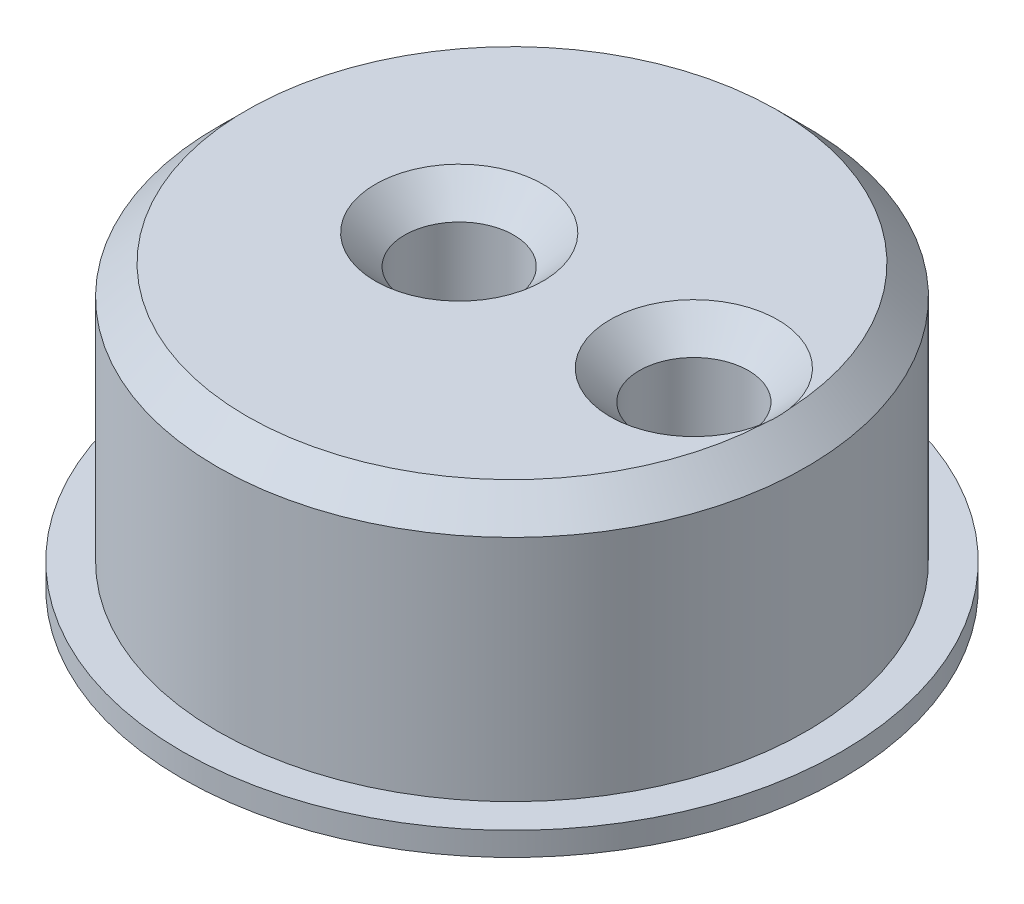
ISO-10303-21;
HEADER;
FILE_DESCRIPTION(('STEP AP214'),'2;1');
FILE_NAME('part.step','',(''),(''),'','','');
FILE_SCHEMA(('AUTOMOTIVE_DESIGN { 1 0 10303 214 1 1 1 1 }'));
ENDSEC;
DATA;
#1=APPLICATION_CONTEXT('core data for automotive mechanical design processes');
#2=APPLICATION_PROTOCOL_DEFINITION('international standard','automotive_design',2000,#1);
#3=PRODUCT_CONTEXT('',#1,'mechanical');
#4=PRODUCT('Part','Part','',(#3));
#5=PRODUCT_RELATED_PRODUCT_CATEGORY('part','',(#4));
#6=PRODUCT_DEFINITION_FORMATION('','',#4);
#7=PRODUCT_DEFINITION_CONTEXT('part definition',#1,'design');
#8=PRODUCT_DEFINITION('design','',#6,#7);
#9=PRODUCT_DEFINITION_SHAPE('','',#8);
#10=(LENGTH_UNIT() NAMED_UNIT(*) SI_UNIT(.MILLI.,.METRE.));
#11=(NAMED_UNIT(*) PLANE_ANGLE_UNIT() SI_UNIT($,.RADIAN.));
#12=(NAMED_UNIT(*) SI_UNIT($,.STERADIAN.) SOLID_ANGLE_UNIT());
#13=UNCERTAINTY_MEASURE_WITH_UNIT(LENGTH_MEASURE(1.E-05),#10,'distance_accuracy_value','');
#14=(GEOMETRIC_REPRESENTATION_CONTEXT(3) GLOBAL_UNCERTAINTY_ASSIGNED_CONTEXT((#13)) GLOBAL_UNIT_ASSIGNED_CONTEXT((#10,
#11,#12)) REPRESENTATION_CONTEXT('',''));
#15=CARTESIAN_POINT('',(0.,0.,0.));
#16=DIRECTION('',(0.,0.,1.));
#17=DIRECTION('',(1.,0.,0.));
#18=AXIS2_PLACEMENT_3D('',#15,#16,#17);
#19=CARTESIAN_POINT('',(0.,4.4,0.));
#20=DIRECTION('',(0.,1.,0.));
#21=DIRECTION('',(0.,0.,1.));
#22=AXIS2_PLACEMENT_3D('',#19,#20,#21);
#23=PLANE('',#22);
#24=CARTESIAN_POINT('',(-0.9,4.4,0.));
#25=DIRECTION('',(0.,1.,0.));
#26=DIRECTION('',(0.,0.,1.));
#27=AXIS2_PLACEMENT_3D('',#24,#25,#26);
#28=CIRCLE('',#27,1.43000000000001);
#29=CARTESIAN_POINT('',(-0.9,4.4,1.43000000000001));
#30=VERTEX_POINT('',#29);
#31=EDGE_CURVE('E57',#30,#30,#28,.F.);
#32=ORIENTED_EDGE('',*,*,#31,.T.);
#33=EDGE_LOOP('',(#32));
#34=FACE_BOUND('',#33,.T.);
#35=CARTESIAN_POINT('',(3.1,4.4,0.));
#36=DIRECTION('',(0.,1.,0.));
#37=DIRECTION('',(0.,0.,1.));
#38=AXIS2_PLACEMENT_3D('',#35,#36,#37);
#39=CIRCLE('',#38,1.43);
#40=CARTESIAN_POINT('',(3.1,4.4,1.43));
#41=VERTEX_POINT('',#40);
#42=CARTESIAN_POINT('',(4.51540322580645,4.4,-0.203798205037956));
#43=VERTEX_POINT('',#42);
#44=EDGE_CURVE('E76',#41,#43,#39,.F.);
#45=ORIENTED_EDGE('',*,*,#44,.T.);
#46=CARTESIAN_POINT('',(0.,4.4,0.));
#47=DIRECTION('',(0.,1.,0.));
#48=DIRECTION('',(0.,0.,1.));
#49=AXIS2_PLACEMENT_3D('',#46,#47,#48);
#50=CIRCLE('',#49,4.52);
#51=CARTESIAN_POINT('',(0.,4.4,4.52));
#52=VERTEX_POINT('',#51);
#53=EDGE_CURVE('E95',#43,#52,#50,.T.);
#54=ORIENTED_EDGE('',*,*,#53,.T.);
#55=CARTESIAN_POINT('',(0.,4.4,0.));
#56=DIRECTION('',(0.,1.,0.));
#57=DIRECTION('',(0.,0.,1.));
#58=AXIS2_PLACEMENT_3D('',#55,#56,#57);
#59=CIRCLE('',#58,4.52);
#60=CARTESIAN_POINT('',(4.51540322580645,4.4,0.203798205037956));
#61=VERTEX_POINT('',#60);
#62=EDGE_CURVE('E64',#52,#61,#59,.T.);
#63=ORIENTED_EDGE('',*,*,#62,.T.);
#64=CARTESIAN_POINT('',(3.1,4.4,0.));
#65=DIRECTION('',(0.,1.,0.));
#66=DIRECTION('',(0.,0.,1.));
#67=AXIS2_PLACEMENT_3D('',#64,#65,#66);
#68=CIRCLE('',#67,1.43);
#69=EDGE_CURVE('E74',#61,#41,#68,.F.);
#70=ORIENTED_EDGE('',*,*,#69,.T.);
#71=EDGE_LOOP('',(#45,#54,#63,#70));
#72=FACE_BOUND('',#71,.T.);
#73=ADVANCED_FACE('F41',(#34,#72),#23,.T.);
#74=CARTESIAN_POINT('',(0.,4.4,0.));
#75=DIRECTION('',(0.,-1.,0.));
#76=DIRECTION('',(0.,0.,-1.));
#77=AXIS2_PLACEMENT_3D('',#74,#75,#76);
#78=CYLINDRICAL_SURFACE('',#77,5.02);
#79=CARTESIAN_POINT('',(0.,3.9,0.));
#80=DIRECTION('',(0.,1.,0.));
#81=DIRECTION('',(0.,0.,1.));
#82=AXIS2_PLACEMENT_3D('',#79,#80,#81);
#83=CIRCLE('',#82,5.02);
#84=CARTESIAN_POINT('',(0.,3.9,5.02));
#85=VERTEX_POINT('',#84);
#86=EDGE_CURVE('E11',#85,#85,#83,.F.);
#87=ORIENTED_EDGE('',*,*,#86,.T.);
#88=EDGE_LOOP('',(#87));
#89=FACE_BOUND('',#88,.T.);
#90=CARTESIAN_POINT('',(0.,0.,0.));
#91=DIRECTION('',(0.,1.,0.));
#92=DIRECTION('',(0.,0.,1.));
#93=AXIS2_PLACEMENT_3D('',#90,#91,#92);
#94=CIRCLE('',#93,5.02);
#95=CARTESIAN_POINT('',(0.,0.,5.02));
#96=VERTEX_POINT('',#95);
#97=EDGE_CURVE('E128',#96,#96,#94,.T.);
#98=ORIENTED_EDGE('',*,*,#97,.T.);
#99=EDGE_LOOP('',(#98));
#100=FACE_BOUND('',#99,.T.);
#101=ADVANCED_FACE('F162',(#89,#100),#78,.T.);
#102=CARTESIAN_POINT('',(3.1,4.4,0.));
#103=DIRECTION('',(0.,-1.,0.));
#104=DIRECTION('',(0.,0.,-1.));
#105=AXIS2_PLACEMENT_3D('',#102,#103,#104);
#106=CYLINDRICAL_SURFACE('',#105,0.930000000000001);
#107=CARTESIAN_POINT('',(3.1,0.100000000000004,0.));
#108=DIRECTION('',(0.,-1.,0.));
#109=DIRECTION('',(0.,0.,-1.));
#110=AXIS2_PLACEMENT_3D('',#107,#108,#109);
#111=CIRCLE('',#110,0.930000000000001);
#112=CARTESIAN_POINT('',(3.1,0.100000000000004,-0.930000000000001));
#113=VERTEX_POINT('',#112);
#114=EDGE_CURVE('E120',#113,#113,#111,.T.);
#115=ORIENTED_EDGE('',*,*,#114,.T.);
#116=EDGE_LOOP('',(#115));
#117=FACE_BOUND('',#116,.T.);
#118=CARTESIAN_POINT('',(3.1,3.9,0.));
#119=DIRECTION('',(0.,1.,0.));
#120=DIRECTION('',(0.,0.,1.));
#121=AXIS2_PLACEMENT_3D('',#118,#119,#120);
#122=CIRCLE('',#121,0.930000000000001);
#123=CARTESIAN_POINT('',(3.1,3.9,0.930000000000001));
#124=VERTEX_POINT('',#123);
#125=EDGE_CURVE('E124',#124,#124,#122,.T.);
#126=ORIENTED_EDGE('',*,*,#125,.T.);
#127=EDGE_LOOP('',(#126));
#128=FACE_BOUND('',#127,.T.);
#129=ADVANCED_FACE('F167',(#117,#128),#106,.F.);
#130=CARTESIAN_POINT('',(-0.9,4.4,0.));
#131=DIRECTION('',(0.,-1.,0.));
#132=DIRECTION('',(0.,0.,-1.));
#133=AXIS2_PLACEMENT_3D('',#130,#131,#132);
#134=CYLINDRICAL_SURFACE('',#133,0.93);
#135=CARTESIAN_POINT('',(-0.9,0.100000000000002,0.));
#136=DIRECTION('',(0.,-1.,0.));
#137=DIRECTION('',(0.,0.,-1.));
#138=AXIS2_PLACEMENT_3D('',#135,#136,#137);
#139=CIRCLE('',#138,0.93);
#140=CARTESIAN_POINT('',(-0.9,0.100000000000002,-0.93));
#141=VERTEX_POINT('',#140);
#142=EDGE_CURVE('E83',#141,#141,#139,.T.);
#143=ORIENTED_EDGE('',*,*,#142,.T.);
#144=EDGE_LOOP('',(#143));
#145=FACE_BOUND('',#144,.T.);
#146=CARTESIAN_POINT('',(-0.9,3.9,0.));
#147=DIRECTION('',(0.,1.,0.));
#148=DIRECTION('',(0.,0.,1.));
#149=AXIS2_PLACEMENT_3D('',#146,#147,#148);
#150=CIRCLE('',#149,0.93);
#151=CARTESIAN_POINT('',(-0.9,3.9,0.930000000000001));
#152=VERTEX_POINT('',#151);
#153=EDGE_CURVE('E89',#152,#152,#150,.T.);
#154=ORIENTED_EDGE('',*,*,#153,.T.);
#155=EDGE_LOOP('',(#154));
#156=FACE_BOUND('',#155,.T.);
#157=ADVANCED_FACE('F157',(#145,#156),#134,.F.);
#158=CARTESIAN_POINT('',(0.,-0.4,0.));
#159=DIRECTION('',(0.,-1.,0.));
#160=DIRECTION('',(0.,0.,-1.));
#161=AXIS2_PLACEMENT_3D('',#158,#159,#160);
#162=PLANE('',#161);
#163=CARTESIAN_POINT('',(3.1,-0.4,0.));
#164=DIRECTION('',(0.,-1.,0.));
#165=DIRECTION('',(0.,0.,-1.));
#166=AXIS2_PLACEMENT_3D('',#163,#164,#165);
#167=CIRCLE('',#166,1.43000000000001);
#168=CARTESIAN_POINT('',(3.1,-0.4,-1.43000000000001));
#169=VERTEX_POINT('',#168);
#170=EDGE_CURVE('E111',#169,#169,#167,.F.);
#171=ORIENTED_EDGE('',*,*,#170,.T.);
#172=EDGE_LOOP('',(#171));
#173=FACE_BOUND('',#172,.T.);
#174=CARTESIAN_POINT('',(-0.9,-0.4,0.));
#175=DIRECTION('',(0.,-1.,0.));
#176=DIRECTION('',(0.,0.,-1.));
#177=AXIS2_PLACEMENT_3D('',#174,#175,#176);
#178=CIRCLE('',#177,1.43);
#179=CARTESIAN_POINT('',(-0.9,-0.4,-1.43));
#180=VERTEX_POINT('',#179);
#181=EDGE_CURVE('E114',#180,#180,#178,.F.);
#182=ORIENTED_EDGE('',*,*,#181,.T.);
#183=EDGE_LOOP('',(#182));
#184=FACE_BOUND('',#183,.T.);
#185=CARTESIAN_POINT('',(0.,-0.4,0.));
#186=DIRECTION('',(0.,-1.,0.));
#187=DIRECTION('',(0.,0.,-1.));
#188=AXIS2_PLACEMENT_3D('',#185,#186,#187);
#189=CIRCLE('',#188,5.62);
#190=CARTESIAN_POINT('',(0.,-0.4,-5.62));
#191=VERTEX_POINT('',#190);
#192=EDGE_CURVE('E132',#191,#191,#189,.T.);
#193=ORIENTED_EDGE('',*,*,#192,.T.);
#194=EDGE_LOOP('',(#193));
#195=FACE_BOUND('',#194,.T.);
#196=ADVANCED_FACE('F141',(#173,#184,#195),#162,.T.);
#197=CARTESIAN_POINT('',(0.,0.,0.));
#198=DIRECTION('',(0.,-1.,0.));
#199=DIRECTION('',(0.,0.,-1.));
#200=AXIS2_PLACEMENT_3D('',#197,#198,#199);
#201=PLANE('',#200);
#202=ORIENTED_EDGE('',*,*,#97,.F.);
#203=EDGE_LOOP('',(#202));
#204=FACE_BOUND('',#203,.T.);
#205=CARTESIAN_POINT('',(0.,0.,0.));
#206=DIRECTION('',(0.,-1.,0.));
#207=DIRECTION('',(0.,0.,-1.));
#208=AXIS2_PLACEMENT_3D('',#205,#206,#207);
#209=CIRCLE('',#208,5.62);
#210=CARTESIAN_POINT('',(0.,0.,-5.62));
#211=VERTEX_POINT('',#210);
#212=EDGE_CURVE('E133',#211,#211,#209,.T.);
#213=ORIENTED_EDGE('',*,*,#212,.F.);
#214=EDGE_LOOP('',(#213));
#215=FACE_BOUND('',#214,.T.);
#216=ADVANCED_FACE('F147',(#204,#215),#201,.F.);
#217=CARTESIAN_POINT('',(0.,-0.4,0.));
#218=DIRECTION('',(0.,1.,0.));
#219=DIRECTION('',(0.,0.,1.));
#220=AXIS2_PLACEMENT_3D('',#217,#218,#219);
#221=CYLINDRICAL_SURFACE('',#220,5.62);
#222=ORIENTED_EDGE('',*,*,#192,.F.);
#223=EDGE_LOOP('',(#222));
#224=FACE_BOUND('',#223,.T.);
#225=ORIENTED_EDGE('',*,*,#212,.T.);
#226=EDGE_LOOP('',(#225));
#227=FACE_BOUND('',#226,.T.);
#228=ADVANCED_FACE('F143',(#224,#227),#221,.T.);
#229=CARTESIAN_POINT('',(3.1,0.100000000000004,0.));
#230=DIRECTION('',(0.,-1.,0.));
#231=DIRECTION('',(0.,0.,-1.));
#232=AXIS2_PLACEMENT_3D('',#229,#230,#231);
#233=CONICAL_SURFACE('',#232,0.930000000000001,0.78539816339745);
#234=ORIENTED_EDGE('',*,*,#170,.F.);
#235=EDGE_LOOP('',(#234));
#236=FACE_BOUND('',#235,.T.);
#237=ORIENTED_EDGE('',*,*,#114,.F.);
#238=EDGE_LOOP('',(#237));
#239=FACE_BOUND('',#238,.T.);
#240=ADVANCED_FACE('F146',(#236,#239),#233,.F.);
#241=CARTESIAN_POINT('',(-0.9,0.100000000000002,0.));
#242=DIRECTION('',(0.,-1.,0.));
#243=DIRECTION('',(0.,0.,-1.));
#244=AXIS2_PLACEMENT_3D('',#241,#242,#243);
#245=CONICAL_SURFACE('',#244,0.93,0.785398163397448);
#246=ORIENTED_EDGE('',*,*,#181,.F.);
#247=EDGE_LOOP('',(#246));
#248=FACE_BOUND('',#247,.T.);
#249=ORIENTED_EDGE('',*,*,#142,.F.);
#250=EDGE_LOOP('',(#249));
#251=FACE_BOUND('',#250,.T.);
#252=ADVANCED_FACE('F105',(#248,#251),#245,.F.);
#253=CARTESIAN_POINT('',(-0.9,3.9,0.));
#254=DIRECTION('',(0.,1.,0.));
#255=DIRECTION('',(0.,0.,1.));
#256=AXIS2_PLACEMENT_3D('',#253,#254,#255);
#257=CONICAL_SURFACE('',#256,0.93,0.78539816339745);
#258=ORIENTED_EDGE('',*,*,#31,.F.);
#259=EDGE_LOOP('',(#258));
#260=FACE_BOUND('',#259,.T.);
#261=ORIENTED_EDGE('',*,*,#153,.F.);
#262=EDGE_LOOP('',(#261));
#263=FACE_BOUND('',#262,.T.);
#264=ADVANCED_FACE('F102',(#260,#263),#257,.F.);
#265=CARTESIAN_POINT('',(3.1,3.9,0.));
#266=DIRECTION('',(0.,1.,0.));
#267=DIRECTION('',(0.,0.,1.));
#268=AXIS2_PLACEMENT_3D('',#265,#266,#267);
#269=CONICAL_SURFACE('',#268,0.930000000000001,0.785398163397448);
#270=ORIENTED_EDGE('',*,*,#125,.F.);
#271=EDGE_LOOP('',(#270));
#272=FACE_BOUND('',#271,.T.);
#273=CARTESIAN_POINT('',(4.5150193548378,4.40020000000048,-0.207827489605648));
#274=CARTESIAN_POINT('',(4.52167311827912,4.39673333333357,-0.138551659738614));
#275=CARTESIAN_POINT('',(4.52499999999986,4.39500000000008,-0.0692758298715706));
#276=CARTESIAN_POINT('',(4.52500000000015,4.39499999999992,0.0692758298625332));
#277=CARTESIAN_POINT('',(4.5216731182797,4.39673333333327,0.138551659729594));
#278=CARTESIAN_POINT('',(4.51501935483866,4.40020000000002,0.207827489596664));
#279=B_SPLINE_CURVE_WITH_KNOTS('',3,(#273,#274,#275,#276,#277,#278),.UNSPECIFIED.,.F.,.F.,(4,2,
4),(0.,0.208131974265768,0.416263948531536),.UNSPECIFIED.);
#280=EDGE_CURVE('E46',#43,#61,#279,.T.);
#281=ORIENTED_EDGE('',*,*,#280,.F.);
#282=ORIENTED_EDGE('',*,*,#44,.F.);
#283=ORIENTED_EDGE('',*,*,#69,.F.);
#284=EDGE_LOOP('',(#281,#282,#283));
#285=FACE_BOUND('',#284,.T.);
#286=ADVANCED_FACE('F81',(#272,#285),#269,.F.);
#287=CARTESIAN_POINT('',(0.,4.4,0.));
#288=DIRECTION('',(0.,-1.,0.));
#289=DIRECTION('',(0.,0.,-1.));
#290=AXIS2_PLACEMENT_3D('',#287,#288,#289);
#291=CONICAL_SURFACE('',#290,4.52,0.785398163397448);
#292=ORIENTED_EDGE('',*,*,#86,.F.);
#293=EDGE_LOOP('',(#292));
#294=FACE_BOUND('',#293,.T.);
#295=ORIENTED_EDGE('',*,*,#53,.F.);
#296=ORIENTED_EDGE('',*,*,#280,.T.);
#297=ORIENTED_EDGE('',*,*,#62,.F.);
#298=EDGE_LOOP('',(#295,#296,#297));
#299=FACE_BOUND('',#298,.T.);
#300=ADVANCED_FACE('F44',(#294,#299),#291,.T.);
#301=CLOSED_SHELL('',(#73,#101,#129,#157,#196,#216,#228,#240,#252,#264,#286,#300));
#302=MANIFOLD_SOLID_BREP('B2',#301);
#303=ADVANCED_BREP_SHAPE_REPRESENTATION('',(#18,#302),#14);
#304=SHAPE_DEFINITION_REPRESENTATION(#9,#303);
ENDSEC;
END-ISO-10303-21;
